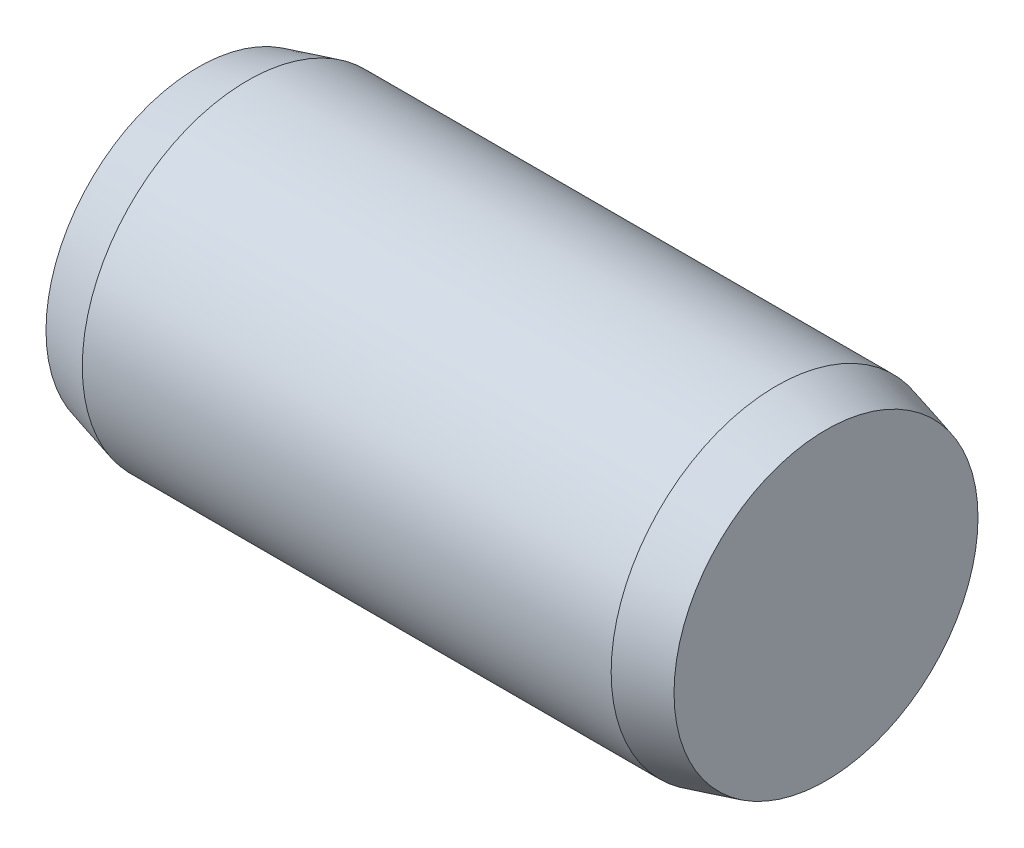
ISO-10303-21;
HEADER;
FILE_DESCRIPTION(('STEP AP214'),'2;1');
FILE_NAME('part.step','',(''),(''),'','','');
FILE_SCHEMA(('AUTOMOTIVE_DESIGN { 1 0 10303 214 1 1 1 1 }'));
ENDSEC;
DATA;
#1=APPLICATION_CONTEXT('core data for automotive mechanical design processes');
#2=APPLICATION_PROTOCOL_DEFINITION('international standard','automotive_design',2000,#1);
#3=PRODUCT_CONTEXT('',#1,'mechanical');
#4=PRODUCT('Part','Part','',(#3));
#5=PRODUCT_RELATED_PRODUCT_CATEGORY('part','',(#4));
#6=PRODUCT_DEFINITION_FORMATION('','',#4);
#7=PRODUCT_DEFINITION_CONTEXT('part definition',#1,'design');
#8=PRODUCT_DEFINITION('design','',#6,#7);
#9=PRODUCT_DEFINITION_SHAPE('','',#8);
#10=(LENGTH_UNIT() NAMED_UNIT(*) SI_UNIT(.MILLI.,.METRE.));
#11=(NAMED_UNIT(*) PLANE_ANGLE_UNIT() SI_UNIT($,.RADIAN.));
#12=(NAMED_UNIT(*) SI_UNIT($,.STERADIAN.) SOLID_ANGLE_UNIT());
#13=UNCERTAINTY_MEASURE_WITH_UNIT(LENGTH_MEASURE(1.E-05),#10,'distance_accuracy_value','');
#14=(GEOMETRIC_REPRESENTATION_CONTEXT(3) GLOBAL_UNCERTAINTY_ASSIGNED_CONTEXT((#13)) GLOBAL_UNIT_ASSIGNED_CONTEXT((#10,
#11,#12)) REPRESENTATION_CONTEXT('',''));
#15=CARTESIAN_POINT('',(0.,0.,0.));
#16=DIRECTION('',(0.,0.,1.));
#17=DIRECTION('',(1.,0.,0.));
#18=AXIS2_PLACEMENT_3D('',#15,#16,#17);
#19=CARTESIAN_POINT('',(-4.,0.,0.));
#20=DIRECTION('',(1.,0.,0.));
#21=DIRECTION('',(0.,0.,1.));
#22=AXIS2_PLACEMENT_3D('',#19,#20,#21);
#23=CYLINDRICAL_SURFACE('',#22,2.5);
#24=CARTESIAN_POINT('',(-4.,0.,0.));
#25=DIRECTION('',(1.,0.,0.));
#26=DIRECTION('',(0.,0.,-1.));
#27=AXIS2_PLACEMENT_3D('',#24,#25,#26);
#28=CIRCLE('',#27,2.5);
#29=CARTESIAN_POINT('',(-4.,0.,-2.5));
#30=VERTEX_POINT('',#29);
#31=EDGE_CURVE('E49',#30,#30,#28,.T.);
#32=ORIENTED_EDGE('',*,*,#31,.T.);
#33=EDGE_LOOP('',(#32));
#34=FACE_BOUND('',#33,.T.);
#35=CARTESIAN_POINT('',(4.,0.,0.));
#36=DIRECTION('',(-1.,0.,0.));
#37=DIRECTION('',(0.,0.,1.));
#38=AXIS2_PLACEMENT_3D('',#35,#36,#37);
#39=CIRCLE('',#38,2.5);
#40=CARTESIAN_POINT('',(4.,0.,2.5));
#41=VERTEX_POINT('',#40);
#42=EDGE_CURVE('E10',#41,#41,#39,.T.);
#43=ORIENTED_EDGE('',*,*,#42,.T.);
#44=EDGE_LOOP('',(#43));
#45=FACE_BOUND('',#44,.T.);
#46=ADVANCED_FACE('F35',(#34,#45),#23,.T.);
#47=CARTESIAN_POINT('',(4.,0.,0.));
#48=DIRECTION('',(-1.,0.,0.));
#49=DIRECTION('',(0.,0.,1.));
#50=AXIS2_PLACEMENT_3D('',#47,#48,#49);
#51=CONICAL_SURFACE('',#50,2.5,0.26179938779915);
#52=CARTESIAN_POINT('',(4.75,0.,0.));
#53=DIRECTION('',(-1.,0.,0.));
#54=DIRECTION('',(0.,0.,1.));
#55=AXIS2_PLACEMENT_3D('',#52,#53,#54);
#56=CIRCLE('',#55,2.29903810567666);
#57=CARTESIAN_POINT('',(4.75,0.,2.29903810567666));
#58=VERTEX_POINT('',#57);
#59=EDGE_CURVE('E41',#58,#58,#56,.T.);
#60=ORIENTED_EDGE('',*,*,#59,.T.);
#61=EDGE_LOOP('',(#60));
#62=FACE_BOUND('',#61,.T.);
#63=ORIENTED_EDGE('',*,*,#42,.F.);
#64=EDGE_LOOP('',(#63));
#65=FACE_BOUND('',#64,.T.);
#66=ADVANCED_FACE('F68',(#62,#65),#51,.T.);
#67=CARTESIAN_POINT('',(4.75,0.,0.));
#68=DIRECTION('',(1.,0.,0.));
#69=DIRECTION('',(0.,0.,1.));
#70=AXIS2_PLACEMENT_3D('',#67,#68,#69);
#71=PLANE('',#70);
#72=ORIENTED_EDGE('',*,*,#59,.F.);
#73=EDGE_LOOP('',(#72));
#74=FACE_BOUND('',#73,.T.);
#75=ADVANCED_FACE('F59',(#74),#71,.T.);
#76=CARTESIAN_POINT('',(-4.,0.,0.));
#77=DIRECTION('',(1.,0.,0.));
#78=DIRECTION('',(0.,0.,-1.));
#79=AXIS2_PLACEMENT_3D('',#76,#77,#78);
#80=CONICAL_SURFACE('',#79,2.5,0.26179938779915);
#81=CARTESIAN_POINT('',(-4.75,0.,0.));
#82=DIRECTION('',(1.,0.,0.));
#83=DIRECTION('',(0.,0.,-1.));
#84=AXIS2_PLACEMENT_3D('',#81,#82,#83);
#85=CIRCLE('',#84,2.29903810567666);
#86=CARTESIAN_POINT('',(-4.75,0.,-2.29903810567666));
#87=VERTEX_POINT('',#86);
#88=EDGE_CURVE('E45',#87,#87,#85,.T.);
#89=ORIENTED_EDGE('',*,*,#88,.T.);
#90=EDGE_LOOP('',(#89));
#91=FACE_BOUND('',#90,.T.);
#92=ORIENTED_EDGE('',*,*,#31,.F.);
#93=EDGE_LOOP('',(#92));
#94=FACE_BOUND('',#93,.T.);
#95=ADVANCED_FACE('F56',(#91,#94),#80,.T.);
#96=CARTESIAN_POINT('',(-4.75,0.,0.));
#97=DIRECTION('',(-1.,0.,0.));
#98=DIRECTION('',(0.,0.,-1.));
#99=AXIS2_PLACEMENT_3D('',#96,#97,#98);
#100=PLANE('',#99);
#101=ORIENTED_EDGE('',*,*,#88,.F.);
#102=EDGE_LOOP('',(#101));
#103=FACE_BOUND('',#102,.T.);
#104=ADVANCED_FACE('F58',(#103),#100,.T.);
#105=CLOSED_SHELL('',(#46,#66,#75,#95,#104));
#106=MANIFOLD_SOLID_BREP('B2',#105);
#107=ADVANCED_BREP_SHAPE_REPRESENTATION('',(#18,#106),#14);
#108=SHAPE_DEFINITION_REPRESENTATION(#9,#107);
ENDSEC;
END-ISO-10303-21;
